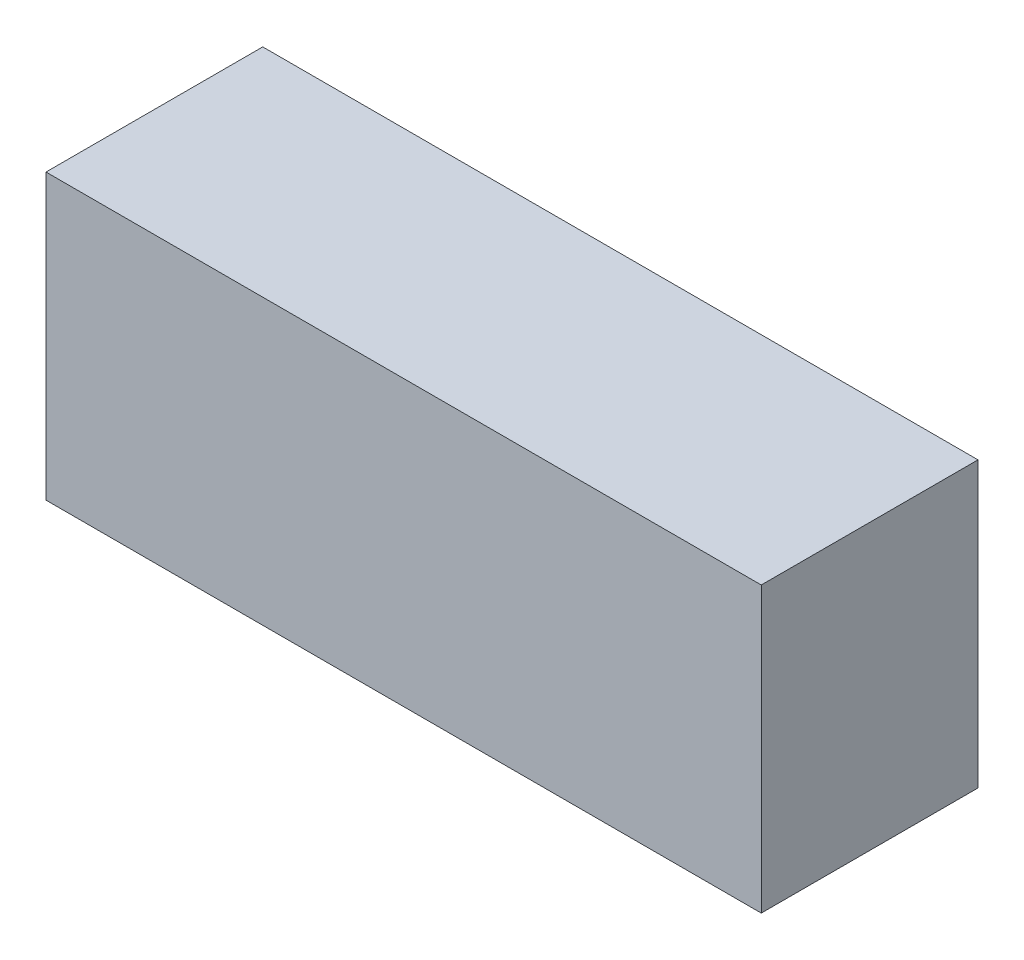
ISO-10303-21;
HEADER;
FILE_DESCRIPTION(('STEP AP214'),'2;1');
FILE_NAME('part.step','',(''),(''),'','','');
FILE_SCHEMA(('AUTOMOTIVE_DESIGN { 1 0 10303 214 1 1 1 1 }'));
ENDSEC;
DATA;
#1=APPLICATION_CONTEXT('core data for automotive mechanical design processes');
#2=APPLICATION_PROTOCOL_DEFINITION('international standard','automotive_design',2000,#1);
#3=PRODUCT_CONTEXT('',#1,'mechanical');
#4=PRODUCT('Part','Part','',(#3));
#5=PRODUCT_RELATED_PRODUCT_CATEGORY('part','',(#4));
#6=PRODUCT_DEFINITION_FORMATION('','',#4);
#7=PRODUCT_DEFINITION_CONTEXT('part definition',#1,'design');
#8=PRODUCT_DEFINITION('design','',#6,#7);
#9=PRODUCT_DEFINITION_SHAPE('','',#8);
#10=(LENGTH_UNIT() NAMED_UNIT(*) SI_UNIT(.MILLI.,.METRE.));
#11=(NAMED_UNIT(*) PLANE_ANGLE_UNIT() SI_UNIT($,.RADIAN.));
#12=(NAMED_UNIT(*) SI_UNIT($,.STERADIAN.) SOLID_ANGLE_UNIT());
#13=UNCERTAINTY_MEASURE_WITH_UNIT(LENGTH_MEASURE(1.E-05),#10,'distance_accuracy_value','');
#14=(GEOMETRIC_REPRESENTATION_CONTEXT(3) GLOBAL_UNCERTAINTY_ASSIGNED_CONTEXT((#13)) GLOBAL_UNIT_ASSIGNED_CONTEXT((#10,
#11,#12)) REPRESENTATION_CONTEXT('',''));
#15=CARTESIAN_POINT('',(0.,0.,0.));
#16=DIRECTION('',(0.,0.,1.));
#17=DIRECTION('',(1.,0.,0.));
#18=AXIS2_PLACEMENT_3D('',#15,#16,#17);
#19=CARTESIAN_POINT('',(44.55,-17.7,27.));
#20=DIRECTION('',(-1.,0.,0.));
#21=DIRECTION('',(0.,0.,1.));
#22=AXIS2_PLACEMENT_3D('',#19,#20,#21);
#23=PLANE('',#22);
#24=DIRECTION('',(0.,1.,0.));
#25=VECTOR('',#24,1.);
#26=CARTESIAN_POINT('',(44.55,-17.7,0.));
#27=LINE('',#26,#25);
#28=CARTESIAN_POINT('',(44.55,-17.7,0.));
#29=VERTEX_POINT('',#28);
#30=CARTESIAN_POINT('',(44.55,17.7,0.));
#31=VERTEX_POINT('',#30);
#32=EDGE_CURVE('E111',#29,#31,#27,.T.);
#33=ORIENTED_EDGE('',*,*,#32,.T.);
#34=DIRECTION('',(0.,0.,-1.));
#35=VECTOR('',#34,1.);
#36=CARTESIAN_POINT('',(44.55,17.7,27.));
#37=LINE('',#36,#35);
#38=CARTESIAN_POINT('',(44.55,17.7,27.));
#39=VERTEX_POINT('',#38);
#40=EDGE_CURVE('E11',#39,#31,#37,.T.);
#41=ORIENTED_EDGE('',*,*,#40,.F.);
#42=DIRECTION('',(0.,1.,0.));
#43=VECTOR('',#42,1.);
#44=CARTESIAN_POINT('',(44.55,-17.7,27.));
#45=LINE('',#44,#43);
#46=CARTESIAN_POINT('',(44.55,-17.7,27.));
#47=VERTEX_POINT('',#46);
#48=EDGE_CURVE('E100',#47,#39,#45,.T.);
#49=ORIENTED_EDGE('',*,*,#48,.F.);
#50=DIRECTION('',(0.,0.,-1.));
#51=VECTOR('',#50,1.);
#52=CARTESIAN_POINT('',(44.55,-17.7,27.));
#53=LINE('',#52,#51);
#54=EDGE_CURVE('E106',#47,#29,#53,.T.);
#55=ORIENTED_EDGE('',*,*,#54,.T.);
#56=EDGE_LOOP('',(#33,#41,#49,#55));
#57=FACE_BOUND('',#56,.T.);
#58=ADVANCED_FACE('F44',(#57),#23,.F.);
#59=CARTESIAN_POINT('',(-44.55,17.7,27.));
#60=DIRECTION('',(0.,-1.,0.));
#61=DIRECTION('',(0.,0.,-1.));
#62=AXIS2_PLACEMENT_3D('',#59,#60,#61);
#63=PLANE('',#62);
#64=DIRECTION('',(-1.,0.,0.));
#65=VECTOR('',#64,1.);
#66=CARTESIAN_POINT('',(-44.55,17.7,0.));
#67=LINE('',#66,#65);
#68=CARTESIAN_POINT('',(-44.55,17.7,0.));
#69=VERTEX_POINT('',#68);
#70=EDGE_CURVE('E105',#31,#69,#67,.T.);
#71=ORIENTED_EDGE('',*,*,#70,.T.);
#72=DIRECTION('',(0.,0.,-1.));
#73=VECTOR('',#72,1.);
#74=CARTESIAN_POINT('',(-44.55,17.7,27.));
#75=LINE('',#74,#73);
#76=CARTESIAN_POINT('',(-44.55,17.7,27.));
#77=VERTEX_POINT('',#76);
#78=EDGE_CURVE('E53',#77,#69,#75,.T.);
#79=ORIENTED_EDGE('',*,*,#78,.F.);
#80=DIRECTION('',(-1.,0.,0.));
#81=VECTOR('',#80,1.);
#82=CARTESIAN_POINT('',(-44.55,17.7,27.));
#83=LINE('',#82,#81);
#84=EDGE_CURVE('E95',#39,#77,#83,.T.);
#85=ORIENTED_EDGE('',*,*,#84,.F.);
#86=ORIENTED_EDGE('',*,*,#40,.T.);
#87=EDGE_LOOP('',(#71,#79,#85,#86));
#88=FACE_BOUND('',#87,.T.);
#89=ADVANCED_FACE('F102',(#88),#63,.F.);
#90=CARTESIAN_POINT('',(-44.55,-17.7,27.));
#91=DIRECTION('',(1.,0.,0.));
#92=DIRECTION('',(0.,0.,-1.));
#93=AXIS2_PLACEMENT_3D('',#90,#91,#92);
#94=PLANE('',#93);
#95=DIRECTION('',(0.,-1.,0.));
#96=VECTOR('',#95,1.);
#97=CARTESIAN_POINT('',(-44.55,-17.7,0.));
#98=LINE('',#97,#96);
#99=CARTESIAN_POINT('',(-44.55,-17.7,0.));
#100=VERTEX_POINT('',#99);
#101=EDGE_CURVE('E80',#69,#100,#98,.T.);
#102=ORIENTED_EDGE('',*,*,#101,.T.);
#103=DIRECTION('',(0.,0.,-1.));
#104=VECTOR('',#103,1.);
#105=CARTESIAN_POINT('',(-44.55,-17.7,27.));
#106=LINE('',#105,#104);
#107=CARTESIAN_POINT('',(-44.55,-17.7,27.));
#108=VERTEX_POINT('',#107);
#109=EDGE_CURVE('E101',#108,#100,#106,.T.);
#110=ORIENTED_EDGE('',*,*,#109,.F.);
#111=DIRECTION('',(0.,-1.,0.));
#112=VECTOR('',#111,1.);
#113=CARTESIAN_POINT('',(-44.55,-17.7,27.));
#114=LINE('',#113,#112);
#115=EDGE_CURVE('E94',#77,#108,#114,.T.);
#116=ORIENTED_EDGE('',*,*,#115,.F.);
#117=ORIENTED_EDGE('',*,*,#78,.T.);
#118=EDGE_LOOP('',(#102,#110,#116,#117));
#119=FACE_BOUND('',#118,.T.);
#120=ADVANCED_FACE('F103',(#119),#94,.F.);
#121=CARTESIAN_POINT('',(-44.55,-17.7,27.));
#122=DIRECTION('',(0.,1.,0.));
#123=DIRECTION('',(0.,0.,1.));
#124=AXIS2_PLACEMENT_3D('',#121,#122,#123);
#125=PLANE('',#124);
#126=DIRECTION('',(1.,0.,0.));
#127=VECTOR('',#126,1.);
#128=CARTESIAN_POINT('',(-44.55,-17.7,0.));
#129=LINE('',#128,#127);
#130=EDGE_CURVE('E82',#100,#29,#129,.T.);
#131=ORIENTED_EDGE('',*,*,#130,.T.);
#132=ORIENTED_EDGE('',*,*,#54,.F.);
#133=DIRECTION('',(1.,0.,0.));
#134=VECTOR('',#133,1.);
#135=CARTESIAN_POINT('',(-44.55,-17.7,27.));
#136=LINE('',#135,#134);
#137=EDGE_CURVE('E64',#108,#47,#136,.T.);
#138=ORIENTED_EDGE('',*,*,#137,.F.);
#139=ORIENTED_EDGE('',*,*,#109,.T.);
#140=EDGE_LOOP('',(#131,#132,#138,#139));
#141=FACE_BOUND('',#140,.T.);
#142=ADVANCED_FACE('F128',(#141),#125,.F.);
#143=CARTESIAN_POINT('',(0.,0.,27.));
#144=DIRECTION('',(0.,0.,-1.));
#145=DIRECTION('',(-1.,0.,0.));
#146=AXIS2_PLACEMENT_3D('',#143,#144,#145);
#147=PLANE('',#146);
#148=ORIENTED_EDGE('',*,*,#48,.T.);
#149=ORIENTED_EDGE('',*,*,#84,.T.);
#150=ORIENTED_EDGE('',*,*,#115,.T.);
#151=ORIENTED_EDGE('',*,*,#137,.T.);
#152=EDGE_LOOP('',(#148,#149,#150,#151));
#153=FACE_BOUND('',#152,.T.);
#154=ADVANCED_FACE('F93',(#153),#147,.F.);
#155=CARTESIAN_POINT('',(0.,0.,0.));
#156=DIRECTION('',(0.,0.,-1.));
#157=DIRECTION('',(-1.,0.,0.));
#158=AXIS2_PLACEMENT_3D('',#155,#156,#157);
#159=PLANE('',#158);
#160=ORIENTED_EDGE('',*,*,#32,.F.);
#161=ORIENTED_EDGE('',*,*,#130,.F.);
#162=ORIENTED_EDGE('',*,*,#101,.F.);
#163=ORIENTED_EDGE('',*,*,#70,.F.);
#164=EDGE_LOOP('',(#160,#161,#162,#163));
#165=FACE_BOUND('',#164,.T.);
#166=ADVANCED_FACE('F129',(#165),#159,.T.);
#167=CLOSED_SHELL('',(#58,#89,#120,#142,#154,#166));
#168=MANIFOLD_SOLID_BREP('B2',#167);
#169=ADVANCED_BREP_SHAPE_REPRESENTATION('',(#18,#168),#14);
#170=SHAPE_DEFINITION_REPRESENTATION(#9,#169);
ENDSEC;
END-ISO-10303-21;
